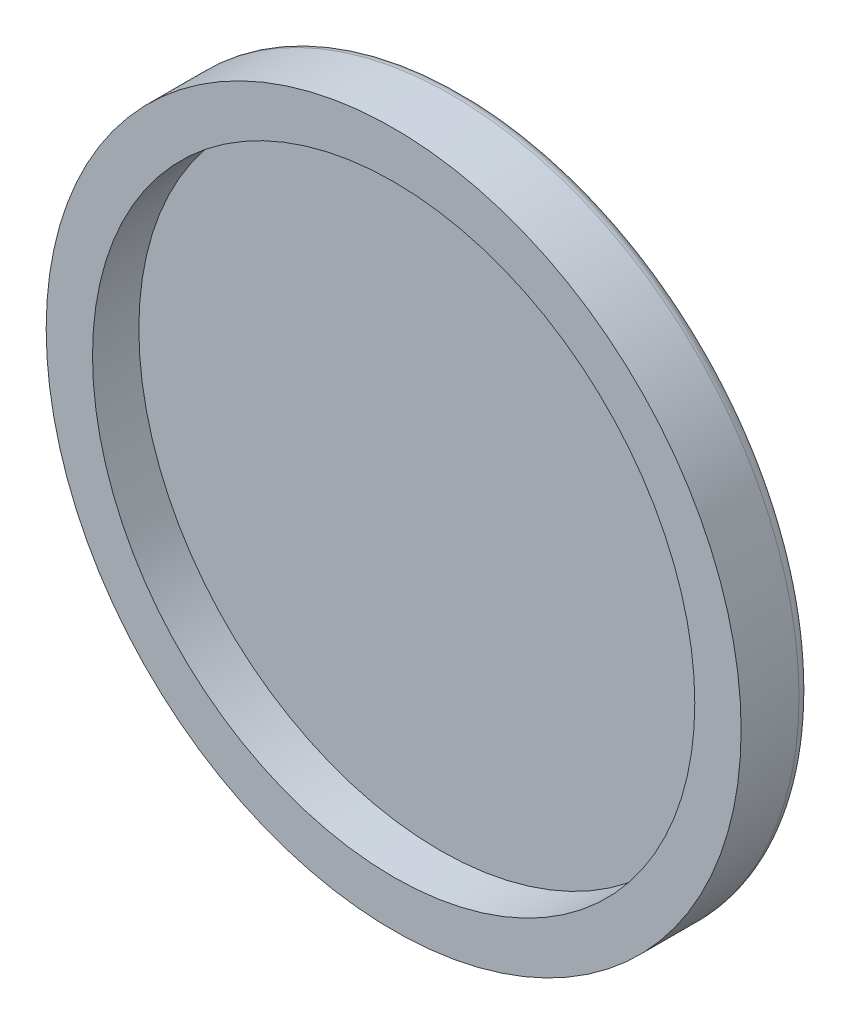
ISO-10303-21;
HEADER;
FILE_DESCRIPTION(('STEP AP214'),'2;1');
FILE_NAME('part.step','',(''),(''),'','','');
FILE_SCHEMA(('AUTOMOTIVE_DESIGN { 1 0 10303 214 1 1 1 1 }'));
ENDSEC;
DATA;
#1=APPLICATION_CONTEXT('core data for automotive mechanical design processes');
#2=APPLICATION_PROTOCOL_DEFINITION('international standard','automotive_design',2000,#1);
#3=PRODUCT_CONTEXT('',#1,'mechanical');
#4=PRODUCT('Part','Part','',(#3));
#5=PRODUCT_RELATED_PRODUCT_CATEGORY('part','',(#4));
#6=PRODUCT_DEFINITION_FORMATION('','',#4);
#7=PRODUCT_DEFINITION_CONTEXT('part definition',#1,'design');
#8=PRODUCT_DEFINITION('design','',#6,#7);
#9=PRODUCT_DEFINITION_SHAPE('','',#8);
#10=(LENGTH_UNIT() NAMED_UNIT(*) SI_UNIT(.MILLI.,.METRE.));
#11=(NAMED_UNIT(*) PLANE_ANGLE_UNIT() SI_UNIT($,.RADIAN.));
#12=(NAMED_UNIT(*) SI_UNIT($,.STERADIAN.) SOLID_ANGLE_UNIT());
#13=UNCERTAINTY_MEASURE_WITH_UNIT(LENGTH_MEASURE(1.E-05),#10,'distance_accuracy_value','');
#14=(GEOMETRIC_REPRESENTATION_CONTEXT(3) GLOBAL_UNCERTAINTY_ASSIGNED_CONTEXT((#13)) GLOBAL_UNIT_ASSIGNED_CONTEXT((#10,
#11,#12)) REPRESENTATION_CONTEXT('',''));
#15=CARTESIAN_POINT('',(0.,0.,0.));
#16=DIRECTION('',(0.,0.,1.));
#17=DIRECTION('',(1.,0.,0.));
#18=AXIS2_PLACEMENT_3D('',#15,#16,#17);
#19=CARTESIAN_POINT('',(0.,0.,2.));
#20=DIRECTION('',(0.,0.,1.));
#21=DIRECTION('',(1.,0.,0.));
#22=AXIS2_PLACEMENT_3D('',#19,#20,#21);
#23=PLANE('',#22);
#24=CARTESIAN_POINT('',(0.,0.,2.));
#25=DIRECTION('',(0.,0.,1.));
#26=DIRECTION('',(1.,0.,0.));
#27=AXIS2_PLACEMENT_3D('',#24,#25,#26);
#28=CIRCLE('',#27,15.);
#29=CARTESIAN_POINT('',(15.,0.,2.));
#30=VERTEX_POINT('',#29);
#31=EDGE_CURVE('E47',#30,#30,#28,.T.);
#32=ORIENTED_EDGE('',*,*,#31,.T.);
#33=EDGE_LOOP('',(#32));
#34=FACE_BOUND('',#33,.T.);
#35=CARTESIAN_POINT('',(0.,0.,2.));
#36=DIRECTION('',(0.,0.,1.));
#37=DIRECTION('',(1.,0.,0.));
#38=AXIS2_PLACEMENT_3D('',#35,#36,#37);
#39=CIRCLE('',#38,13.);
#40=CARTESIAN_POINT('',(13.,0.,2.));
#41=VERTEX_POINT('',#40);
#42=EDGE_CURVE('E51',#41,#41,#39,.T.);
#43=ORIENTED_EDGE('',*,*,#42,.F.);
#44=EDGE_LOOP('',(#43));
#45=FACE_BOUND('',#44,.T.);
#46=ADVANCED_FACE('F36',(#34,#45),#23,.T.);
#47=CARTESIAN_POINT('',(0.,0.,2.));
#48=DIRECTION('',(0.,0.,-1.));
#49=DIRECTION('',(-1.,0.,0.));
#50=AXIS2_PLACEMENT_3D('',#47,#48,#49);
#51=CYLINDRICAL_SURFACE('',#50,15.);
#52=CARTESIAN_POINT('',(0.,0.,-0.5));
#53=DIRECTION('',(0.,0.,-1.));
#54=DIRECTION('',(-1.,0.,0.));
#55=AXIS2_PLACEMENT_3D('',#52,#53,#54);
#56=CIRCLE('',#55,15.);
#57=CARTESIAN_POINT('',(-15.,0.,-0.5));
#58=VERTEX_POINT('',#57);
#59=EDGE_CURVE('E11',#58,#58,#56,.F.);
#60=ORIENTED_EDGE('',*,*,#59,.T.);
#61=EDGE_LOOP('',(#60));
#62=FACE_BOUND('',#61,.T.);
#63=ORIENTED_EDGE('',*,*,#31,.F.);
#64=EDGE_LOOP('',(#63));
#65=FACE_BOUND('',#64,.T.);
#66=ADVANCED_FACE('F64',(#62,#65),#51,.T.);
#67=CARTESIAN_POINT('',(0.,0.,2.));
#68=DIRECTION('',(0.,0.,-1.));
#69=DIRECTION('',(-1.,0.,0.));
#70=AXIS2_PLACEMENT_3D('',#67,#68,#69);
#71=CYLINDRICAL_SURFACE('',#70,13.);
#72=ORIENTED_EDGE('',*,*,#42,.T.);
#73=EDGE_LOOP('',(#72));
#74=FACE_BOUND('',#73,.T.);
#75=CARTESIAN_POINT('',(0.,0.,0.));
#76=DIRECTION('',(0.,0.,1.));
#77=DIRECTION('',(1.,0.,0.));
#78=AXIS2_PLACEMENT_3D('',#75,#76,#77);
#79=CIRCLE('',#78,13.);
#80=CARTESIAN_POINT('',(13.,0.,0.));
#81=VERTEX_POINT('',#80);
#82=EDGE_CURVE('E54',#81,#81,#79,.T.);
#83=ORIENTED_EDGE('',*,*,#82,.F.);
#84=EDGE_LOOP('',(#83));
#85=FACE_BOUND('',#84,.T.);
#86=ADVANCED_FACE('F60',(#74,#85),#71,.F.);
#87=CARTESIAN_POINT('',(0.,0.,0.));
#88=DIRECTION('',(0.,0.,-1.));
#89=DIRECTION('',(-1.,0.,0.));
#90=AXIS2_PLACEMENT_3D('',#87,#88,#89);
#91=PLANE('',#90);
#92=ORIENTED_EDGE('',*,*,#82,.T.);
#93=EDGE_LOOP('',(#92));
#94=FACE_BOUND('',#93,.T.);
#95=ADVANCED_FACE('F73',(#94),#91,.F.);
#96=CARTESIAN_POINT('',(0.,0.,-1.));
#97=DIRECTION('',(0.,0.,-1.));
#98=DIRECTION('',(-1.,0.,0.));
#99=AXIS2_PLACEMENT_3D('',#96,#97,#98);
#100=PLANE('',#99);
#101=CARTESIAN_POINT('',(0.,0.,-1.));
#102=DIRECTION('',(0.,0.,-1.));
#103=DIRECTION('',(-1.,0.,0.));
#104=AXIS2_PLACEMENT_3D('',#101,#102,#103);
#105=CIRCLE('',#104,14.5);
#106=CARTESIAN_POINT('',(-14.5,0.,-1.));
#107=VERTEX_POINT('',#106);
#108=EDGE_CURVE('E43',#107,#107,#105,.T.);
#109=ORIENTED_EDGE('',*,*,#108,.T.);
#110=EDGE_LOOP('',(#109));
#111=FACE_BOUND('',#110,.T.);
#112=ADVANCED_FACE('F76',(#111),#100,.T.);
#113=CARTESIAN_POINT('',(0.,0.,-0.5));
#114=DIRECTION('',(0.,0.,-1.));
#115=DIRECTION('',(-1.,0.,0.));
#116=AXIS2_PLACEMENT_3D('',#113,#114,#115);
#117=TOROIDAL_SURFACE('',#116,14.5,0.5);
#118=ORIENTED_EDGE('',*,*,#59,.F.);
#119=EDGE_LOOP('',(#118));
#120=FACE_BOUND('',#119,.T.);
#121=ORIENTED_EDGE('',*,*,#108,.F.);
#122=EDGE_LOOP('',(#121));
#123=FACE_BOUND('',#122,.T.);
#124=ADVANCED_FACE('F38',(#120,#123),#117,.T.);
#125=CLOSED_SHELL('',(#46,#66,#86,#95,#112,#124));
#126=MANIFOLD_SOLID_BREP('B2',#125);
#127=ADVANCED_BREP_SHAPE_REPRESENTATION('',(#18,#126),#14);
#128=SHAPE_DEFINITION_REPRESENTATION(#9,#127);
ENDSEC;
END-ISO-10303-21;
